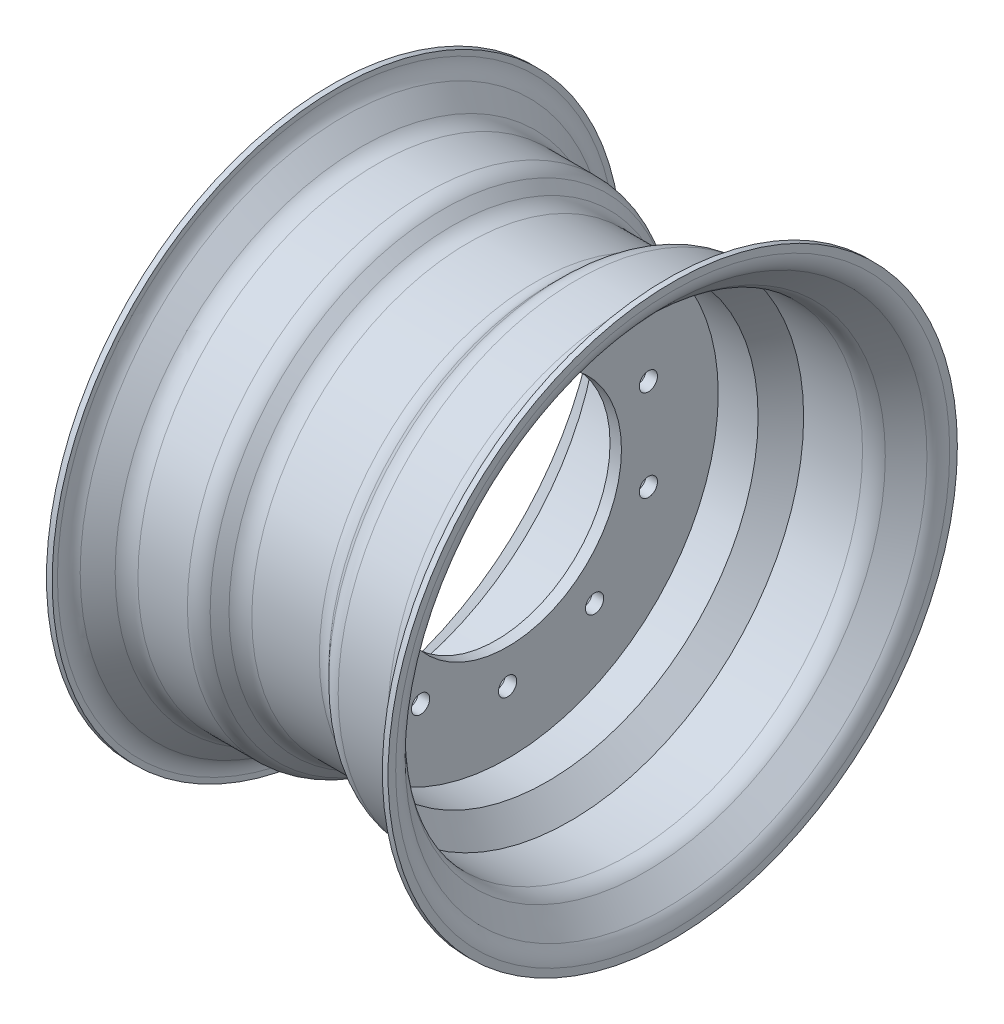
ISO-10303-21;
HEADER;
FILE_DESCRIPTION(('STEP AP214'),'2;1');
FILE_NAME('part.step','',(''),(''),'','','');
FILE_SCHEMA(('AUTOMOTIVE_DESIGN { 1 0 10303 214 1 1 1 1 }'));
ENDSEC;
DATA;
#1=APPLICATION_CONTEXT('core data for automotive mechanical design processes');
#2=APPLICATION_PROTOCOL_DEFINITION('international standard','automotive_design',2000,#1);
#3=PRODUCT_CONTEXT('',#1,'mechanical');
#4=PRODUCT('Part','Part','',(#3));
#5=PRODUCT_RELATED_PRODUCT_CATEGORY('part','',(#4));
#6=PRODUCT_DEFINITION_FORMATION('','',#4);
#7=PRODUCT_DEFINITION_CONTEXT('part definition',#1,'design');
#8=PRODUCT_DEFINITION('design','',#6,#7);
#9=PRODUCT_DEFINITION_SHAPE('','',#8);
#10=(LENGTH_UNIT() NAMED_UNIT(*) SI_UNIT(.MILLI.,.METRE.));
#11=(NAMED_UNIT(*) PLANE_ANGLE_UNIT() SI_UNIT($,.RADIAN.));
#12=(NAMED_UNIT(*) SI_UNIT($,.STERADIAN.) SOLID_ANGLE_UNIT());
#13=UNCERTAINTY_MEASURE_WITH_UNIT(LENGTH_MEASURE(1.E-05),#10,'distance_accuracy_value','');
#14=(GEOMETRIC_REPRESENTATION_CONTEXT(3) GLOBAL_UNCERTAINTY_ASSIGNED_CONTEXT((#13)) GLOBAL_UNIT_ASSIGNED_CONTEXT((#10,
#11,#12)) REPRESENTATION_CONTEXT('',''));
#15=CARTESIAN_POINT('',(0.,0.,0.));
#16=DIRECTION('',(0.,0.,1.));
#17=DIRECTION('',(1.,0.,0.));
#18=AXIS2_PLACEMENT_3D('',#15,#16,#17);
#19=CARTESIAN_POINT('',(0.,0.,0.));
#20=DIRECTION('',(1.,0.,0.));
#21=DIRECTION('',(0.,0.,-1.));
#22=AXIS2_PLACEMENT_3D('',#19,#20,#21);
#23=CYLINDRICAL_SURFACE('',#22,250.);
#24=CARTESIAN_POINT('',(-150.,0.,0.));
#25=DIRECTION('',(1.,0.,0.));
#26=DIRECTION('',(0.,0.,-1.));
#27=AXIS2_PLACEMENT_3D('',#24,#25,#26);
#28=CIRCLE('',#27,250.);
#29=CARTESIAN_POINT('',(-150.,0.,-250.));
#30=VERTEX_POINT('',#29);
#31=EDGE_CURVE('E135',#30,#30,#28,.T.);
#32=ORIENTED_EDGE('',*,*,#31,.T.);
#33=EDGE_LOOP('',(#32));
#34=FACE_BOUND('',#33,.T.);
#35=CARTESIAN_POINT('',(-145.,0.,0.));
#36=DIRECTION('',(1.,0.,0.));
#37=DIRECTION('',(0.,0.,-1.));
#38=AXIS2_PLACEMENT_3D('',#35,#36,#37);
#39=CIRCLE('',#38,250.);
#40=CARTESIAN_POINT('',(-145.,0.,-250.));
#41=VERTEX_POINT('',#40);
#42=EDGE_CURVE('E93',#41,#41,#39,.T.);
#43=ORIENTED_EDGE('',*,*,#42,.F.);
#44=EDGE_LOOP('',(#43));
#45=FACE_BOUND('',#44,.T.);
#46=ADVANCED_FACE('F31',(#34,#45),#23,.T.);
#47=CARTESIAN_POINT('',(-145.,250.,0.));
#48=DIRECTION('',(1.,0.,0.));
#49=DIRECTION('',(0.,0.,-1.));
#50=AXIS2_PLACEMENT_3D('',#47,#48,#49);
#51=PLANE('',#50);
#52=CARTESIAN_POINT('',(-145.,0.,0.));
#53=DIRECTION('',(1.,0.,0.));
#54=DIRECTION('',(0.,0.,-1.));
#55=AXIS2_PLACEMENT_3D('',#52,#53,#54);
#56=CIRCLE('',#55,245.355339059327);
#57=CARTESIAN_POINT('',(-145.,0.,-245.355339059327));
#58=VERTEX_POINT('',#57);
#59=EDGE_CURVE('E72',#58,#58,#56,.F.);
#60=ORIENTED_EDGE('',*,*,#59,.T.);
#61=EDGE_LOOP('',(#60));
#62=FACE_BOUND('',#61,.T.);
#63=ORIENTED_EDGE('',*,*,#42,.T.);
#64=EDGE_LOOP('',(#63));
#65=FACE_BOUND('',#64,.T.);
#66=ADVANCED_FACE('F269',(#62,#65),#51,.T.);
#67=CARTESIAN_POINT('',(-117.928932188135,0.,0.));
#68=DIRECTION('',(-1.,0.,0.));
#69=DIRECTION('',(0.,0.,1.));
#70=AXIS2_PLACEMENT_3D('',#67,#68,#69);
#71=CONICAL_SURFACE('',#70,210.,0.785398163397448);
#72=CARTESIAN_POINT('',(-139.142135623731,0.,0.));
#73=DIRECTION('',(-1.,0.,0.));
#74=DIRECTION('',(0.,0.,1.));
#75=AXIS2_PLACEMENT_3D('',#72,#73,#74);
#76=CIRCLE('',#75,231.213203435596);
#77=CARTESIAN_POINT('',(-139.142135623731,0.,231.213203435596));
#78=VERTEX_POINT('',#77);
#79=EDGE_CURVE('E75',#78,#78,#76,.F.);
#80=ORIENTED_EDGE('',*,*,#79,.T.);
#81=EDGE_LOOP('',(#80));
#82=FACE_BOUND('',#81,.T.);
#83=CARTESIAN_POINT('',(-123.786796564404,0.,0.));
#84=DIRECTION('',(-1.,0.,0.));
#85=DIRECTION('',(0.,0.,1.));
#86=AXIS2_PLACEMENT_3D('',#83,#84,#85);
#87=CIRCLE('',#86,215.857864376269);
#88=CARTESIAN_POINT('',(-123.786796564404,0.,215.857864376269));
#89=VERTEX_POINT('',#88);
#90=EDGE_CURVE('E78',#89,#89,#87,.T.);
#91=ORIENTED_EDGE('',*,*,#90,.T.);
#92=EDGE_LOOP('',(#91));
#93=FACE_BOUND('',#92,.T.);
#94=ADVANCED_FACE('F274',(#82,#93),#71,.T.);
#95=CARTESIAN_POINT('',(0.,0.,0.));
#96=DIRECTION('',(1.,0.,0.));
#97=DIRECTION('',(0.,0.,-1.));
#98=AXIS2_PLACEMENT_3D('',#95,#96,#97);
#99=CYLINDRICAL_SURFACE('',#98,210.);
#100=CARTESIAN_POINT('',(-66.2132034355965,0.,0.));
#101=DIRECTION('',(-1.,0.,0.));
#102=DIRECTION('',(0.,0.,1.));
#103=AXIS2_PLACEMENT_3D('',#100,#101,#102);
#104=CIRCLE('',#103,210.);
#105=CARTESIAN_POINT('',(-66.2132034355965,0.,210.));
#106=VERTEX_POINT('',#105);
#107=EDGE_CURVE('E10',#106,#106,#104,.T.);
#108=ORIENTED_EDGE('',*,*,#107,.T.);
#109=EDGE_LOOP('',(#108));
#110=FACE_BOUND('',#109,.T.);
#111=CARTESIAN_POINT('',(-109.644660940673,0.,0.));
#112=DIRECTION('',(1.,0.,0.));
#113=DIRECTION('',(0.,0.,-1.));
#114=AXIS2_PLACEMENT_3D('',#111,#112,#113);
#115=CIRCLE('',#114,210.);
#116=CARTESIAN_POINT('',(-109.644660940673,0.,-210.));
#117=VERTEX_POINT('',#116);
#118=EDGE_CURVE('E38',#117,#117,#115,.T.);
#119=ORIENTED_EDGE('',*,*,#118,.T.);
#120=EDGE_LOOP('',(#119));
#121=FACE_BOUND('',#120,.T.);
#122=ADVANCED_FACE('F280',(#110,#121),#99,.T.);
#123=CARTESIAN_POINT('',(-37.9289321881346,0.,0.));
#124=DIRECTION('',(-1.,0.,0.));
#125=DIRECTION('',(0.,0.,1.));
#126=AXIS2_PLACEMENT_3D('',#123,#124,#125);
#127=CONICAL_SURFACE('',#126,190.,0.785398163397448);
#128=CARTESIAN_POINT('',(-43.7867965644037,0.,0.));
#129=DIRECTION('',(-1.,0.,0.));
#130=DIRECTION('',(0.,0.,1.));
#131=AXIS2_PLACEMENT_3D('',#128,#129,#130);
#132=CIRCLE('',#131,195.857864376269);
#133=CARTESIAN_POINT('',(-43.7867965644037,0.,195.857864376269));
#134=VERTEX_POINT('',#133);
#135=EDGE_CURVE('E42',#134,#134,#132,.T.);
#136=ORIENTED_EDGE('',*,*,#135,.T.);
#137=EDGE_LOOP('',(#136));
#138=FACE_BOUND('',#137,.T.);
#139=CARTESIAN_POINT('',(-52.0710678118656,0.,0.));
#140=DIRECTION('',(1.,0.,0.));
#141=DIRECTION('',(0.,0.,-1.));
#142=AXIS2_PLACEMENT_3D('',#139,#140,#141);
#143=CIRCLE('',#142,204.142135623731);
#144=CARTESIAN_POINT('',(-52.0710678118656,0.,-204.142135623731));
#145=VERTEX_POINT('',#144);
#146=EDGE_CURVE('E46',#145,#145,#143,.T.);
#147=ORIENTED_EDGE('',*,*,#146,.T.);
#148=EDGE_LOOP('',(#147));
#149=FACE_BOUND('',#148,.T.);
#150=ADVANCED_FACE('F322',(#138,#149),#127,.T.);
#151=CARTESIAN_POINT('',(0.,0.,0.));
#152=DIRECTION('',(1.,0.,0.));
#153=DIRECTION('',(0.,0.,-1.));
#154=AXIS2_PLACEMENT_3D('',#151,#152,#153);
#155=CYLINDRICAL_SURFACE('',#154,190.);
#156=CARTESIAN_POINT('',(29.6446609406728,0.,0.));
#157=DIRECTION('',(1.,0.,0.));
#158=DIRECTION('',(0.,0.,-1.));
#159=AXIS2_PLACEMENT_3D('',#156,#157,#158);
#160=CIRCLE('',#159,190.);
#161=CARTESIAN_POINT('',(29.6446609406728,0.,-190.));
#162=VERTEX_POINT('',#161);
#163=EDGE_CURVE('E51',#162,#162,#160,.F.);
#164=ORIENTED_EDGE('',*,*,#163,.T.);
#165=EDGE_LOOP('',(#164));
#166=FACE_BOUND('',#165,.T.);
#167=CARTESIAN_POINT('',(-29.6446609406727,0.,0.));
#168=DIRECTION('',(1.,0.,0.));
#169=DIRECTION('',(0.,0.,-1.));
#170=AXIS2_PLACEMENT_3D('',#167,#168,#169);
#171=CIRCLE('',#170,190.);
#172=CARTESIAN_POINT('',(-29.6446609406727,0.,-190.));
#173=VERTEX_POINT('',#172);
#174=EDGE_CURVE('E54',#173,#173,#171,.T.);
#175=ORIENTED_EDGE('',*,*,#174,.T.);
#176=EDGE_LOOP('',(#175));
#177=FACE_BOUND('',#176,.T.);
#178=ADVANCED_FACE('F324',(#166,#177),#155,.T.);
#179=CARTESIAN_POINT('',(57.9289321881346,0.,0.));
#180=DIRECTION('',(1.,0.,0.));
#181=DIRECTION('',(0.,0.,-1.));
#182=AXIS2_PLACEMENT_3D('',#179,#180,#181);
#183=CONICAL_SURFACE('',#182,210.,0.785398163397448);
#184=CARTESIAN_POINT('',(52.0710678118655,0.,0.));
#185=DIRECTION('',(-1.,0.,0.));
#186=DIRECTION('',(0.,0.,1.));
#187=AXIS2_PLACEMENT_3D('',#184,#185,#186);
#188=CIRCLE('',#187,204.142135623731);
#189=CARTESIAN_POINT('',(52.0710678118655,0.,204.142135623731));
#190=VERTEX_POINT('',#189);
#191=EDGE_CURVE('E57',#190,#190,#188,.T.);
#192=ORIENTED_EDGE('',*,*,#191,.T.);
#193=EDGE_LOOP('',(#192));
#194=FACE_BOUND('',#193,.T.);
#195=CARTESIAN_POINT('',(43.7867965644037,0.,0.));
#196=DIRECTION('',(1.,0.,0.));
#197=DIRECTION('',(0.,0.,-1.));
#198=AXIS2_PLACEMENT_3D('',#195,#196,#197);
#199=CIRCLE('',#198,195.857864376269);
#200=CARTESIAN_POINT('',(43.7867965644037,0.,-195.857864376269));
#201=VERTEX_POINT('',#200);
#202=EDGE_CURVE('E60',#201,#201,#199,.T.);
#203=ORIENTED_EDGE('',*,*,#202,.T.);
#204=EDGE_LOOP('',(#203));
#205=FACE_BOUND('',#204,.T.);
#206=ADVANCED_FACE('F331',(#194,#205),#183,.T.);
#207=CARTESIAN_POINT('',(0.,0.,0.));
#208=DIRECTION('',(1.,0.,0.));
#209=DIRECTION('',(0.,0.,-1.));
#210=AXIS2_PLACEMENT_3D('',#207,#208,#209);
#211=CYLINDRICAL_SURFACE('',#210,210.);
#212=CARTESIAN_POINT('',(109.644660940673,0.,0.));
#213=DIRECTION('',(1.,0.,0.));
#214=DIRECTION('',(0.,0.,-1.));
#215=AXIS2_PLACEMENT_3D('',#212,#213,#214);
#216=CIRCLE('',#215,210.);
#217=CARTESIAN_POINT('',(109.644660940673,0.,-210.));
#218=VERTEX_POINT('',#217);
#219=EDGE_CURVE('E63',#218,#218,#216,.F.);
#220=ORIENTED_EDGE('',*,*,#219,.T.);
#221=EDGE_LOOP('',(#220));
#222=FACE_BOUND('',#221,.T.);
#223=CARTESIAN_POINT('',(66.2132034355965,0.,0.));
#224=DIRECTION('',(-1.,0.,0.));
#225=DIRECTION('',(0.,0.,1.));
#226=AXIS2_PLACEMENT_3D('',#223,#224,#225);
#227=CIRCLE('',#226,210.);
#228=CARTESIAN_POINT('',(66.2132034355965,0.,210.));
#229=VERTEX_POINT('',#228);
#230=EDGE_CURVE('E66',#229,#229,#227,.F.);
#231=ORIENTED_EDGE('',*,*,#230,.T.);
#232=EDGE_LOOP('',(#231));
#233=FACE_BOUND('',#232,.T.);
#234=ADVANCED_FACE('F337',(#222,#233),#211,.T.);
#235=CARTESIAN_POINT('',(145.,0.,0.));
#236=DIRECTION('',(1.,0.,0.));
#237=DIRECTION('',(0.,0.,-1.));
#238=AXIS2_PLACEMENT_3D('',#235,#236,#237);
#239=CONICAL_SURFACE('',#238,237.071067811865,0.785398163397448);
#240=CARTESIAN_POINT('',(123.786796564404,0.,0.));
#241=DIRECTION('',(1.,0.,0.));
#242=DIRECTION('',(0.,0.,-1.));
#243=AXIS2_PLACEMENT_3D('',#240,#241,#242);
#244=CIRCLE('',#243,215.857864376269);
#245=CARTESIAN_POINT('',(123.786796564404,0.,-215.857864376269));
#246=VERTEX_POINT('',#245);
#247=EDGE_CURVE('E69',#246,#246,#244,.T.);
#248=ORIENTED_EDGE('',*,*,#247,.T.);
#249=EDGE_LOOP('',(#248));
#250=FACE_BOUND('',#249,.T.);
#251=CARTESIAN_POINT('',(145.,0.,0.));
#252=DIRECTION('',(1.,0.,0.));
#253=DIRECTION('',(0.,0.,-1.));
#254=AXIS2_PLACEMENT_3D('',#251,#252,#253);
#255=CIRCLE('',#254,237.071067811865);
#256=CARTESIAN_POINT('',(145.,0.,-237.071067811865));
#257=VERTEX_POINT('',#256);
#258=EDGE_CURVE('E96',#257,#257,#255,.T.);
#259=ORIENTED_EDGE('',*,*,#258,.F.);
#260=EDGE_LOOP('',(#259));
#261=FACE_BOUND('',#260,.T.);
#262=ADVANCED_FACE('F341',(#250,#261),#239,.T.);
#263=CARTESIAN_POINT('',(145.,250.,0.));
#264=DIRECTION('',(-1.,0.,0.));
#265=DIRECTION('',(0.,0.,1.));
#266=AXIS2_PLACEMENT_3D('',#263,#264,#265);
#267=PLANE('',#266);
#268=ORIENTED_EDGE('',*,*,#258,.T.);
#269=EDGE_LOOP('',(#268));
#270=FACE_BOUND('',#269,.T.);
#271=CARTESIAN_POINT('',(145.,0.,0.));
#272=DIRECTION('',(1.,0.,0.));
#273=DIRECTION('',(0.,0.,-1.));
#274=AXIS2_PLACEMENT_3D('',#271,#272,#273);
#275=CIRCLE('',#274,250.);
#276=CARTESIAN_POINT('',(145.,0.,-250.));
#277=VERTEX_POINT('',#276);
#278=EDGE_CURVE('E99',#277,#277,#275,.T.);
#279=ORIENTED_EDGE('',*,*,#278,.F.);
#280=EDGE_LOOP('',(#279));
#281=FACE_BOUND('',#280,.T.);
#282=ADVANCED_FACE('F345',(#270,#281),#267,.T.);
#283=CARTESIAN_POINT('',(0.,0.,0.));
#284=DIRECTION('',(1.,0.,0.));
#285=DIRECTION('',(0.,0.,-1.));
#286=AXIS2_PLACEMENT_3D('',#283,#284,#285);
#287=CYLINDRICAL_SURFACE('',#286,250.);
#288=ORIENTED_EDGE('',*,*,#278,.T.);
#289=EDGE_LOOP('',(#288));
#290=FACE_BOUND('',#289,.T.);
#291=CARTESIAN_POINT('',(150.,0.,0.));
#292=DIRECTION('',(1.,0.,0.));
#293=DIRECTION('',(0.,0.,-1.));
#294=AXIS2_PLACEMENT_3D('',#291,#292,#293);
#295=CIRCLE('',#294,250.);
#296=CARTESIAN_POINT('',(150.,0.,-250.));
#297=VERTEX_POINT('',#296);
#298=EDGE_CURVE('E102',#297,#297,#295,.T.);
#299=ORIENTED_EDGE('',*,*,#298,.F.);
#300=EDGE_LOOP('',(#299));
#301=FACE_BOUND('',#300,.T.);
#302=ADVANCED_FACE('F349',(#290,#301),#287,.T.);
#303=CARTESIAN_POINT('',(150.,250.,0.));
#304=DIRECTION('',(1.,0.,0.));
#305=DIRECTION('',(0.,0.,-1.));
#306=AXIS2_PLACEMENT_3D('',#303,#304,#305);
#307=PLANE('',#306);
#308=CARTESIAN_POINT('',(150.,0.,0.));
#309=DIRECTION('',(1.,0.,0.));
#310=DIRECTION('',(0.,0.,-1.));
#311=AXIS2_PLACEMENT_3D('',#308,#309,#310);
#312=CIRCLE('',#311,243.284271247462);
#313=CARTESIAN_POINT('',(150.,0.,-243.284271247462));
#314=VERTEX_POINT('',#313);
#315=EDGE_CURVE('E81',#314,#314,#312,.F.);
#316=ORIENTED_EDGE('',*,*,#315,.T.);
#317=EDGE_LOOP('',(#316));
#318=FACE_BOUND('',#317,.T.);
#319=ORIENTED_EDGE('',*,*,#298,.T.);
#320=EDGE_LOOP('',(#319));
#321=FACE_BOUND('',#320,.T.);
#322=ADVANCED_FACE('F353',(#318,#321),#307,.T.);
#323=CARTESIAN_POINT('',(120.,0.,0.));
#324=DIRECTION('',(1.,0.,0.));
#325=DIRECTION('',(0.,0.,-1.));
#326=AXIS2_PLACEMENT_3D('',#323,#324,#325);
#327=CONICAL_SURFACE('',#326,205.,0.785398163397447);
#328=CARTESIAN_POINT('',(125.857864376269,0.,0.));
#329=DIRECTION('',(-1.,0.,0.));
#330=DIRECTION('',(0.,0.,1.));
#331=AXIS2_PLACEMENT_3D('',#328,#329,#330);
#332=CIRCLE('',#331,210.857864376269);
#333=CARTESIAN_POINT('',(125.857864376269,0.,210.857864376269));
#334=VERTEX_POINT('',#333);
#335=EDGE_CURVE('E84',#334,#334,#332,.T.);
#336=ORIENTED_EDGE('',*,*,#335,.T.);
#337=EDGE_LOOP('',(#336));
#338=FACE_BOUND('',#337,.T.);
#339=CARTESIAN_POINT('',(144.142135623731,0.,0.));
#340=DIRECTION('',(-1.,0.,0.));
#341=DIRECTION('',(0.,0.,1.));
#342=AXIS2_PLACEMENT_3D('',#339,#340,#341);
#343=CIRCLE('',#342,229.142135623731);
#344=CARTESIAN_POINT('',(144.142135623731,0.,229.142135623731));
#345=VERTEX_POINT('',#344);
#346=EDGE_CURVE('E87',#345,#345,#343,.F.);
#347=ORIENTED_EDGE('',*,*,#346,.T.);
#348=EDGE_LOOP('',(#347));
#349=FACE_BOUND('',#348,.T.);
#350=ADVANCED_FACE('F357',(#338,#349),#327,.F.);
#351=CARTESIAN_POINT('',(0.,0.,0.));
#352=DIRECTION('',(1.,0.,0.));
#353=DIRECTION('',(0.,0.,-1.));
#354=AXIS2_PLACEMENT_3D('',#351,#352,#353);
#355=CYLINDRICAL_SURFACE('',#354,205.);
#356=CARTESIAN_POINT('',(111.715728752538,0.,0.));
#357=DIRECTION('',(-1.,0.,0.));
#358=DIRECTION('',(0.,0.,1.));
#359=AXIS2_PLACEMENT_3D('',#356,#357,#358);
#360=CIRCLE('',#359,205.);
#361=CARTESIAN_POINT('',(111.715728752538,0.,205.));
#362=VERTEX_POINT('',#361);
#363=EDGE_CURVE('E90',#362,#362,#360,.F.);
#364=ORIENTED_EDGE('',*,*,#363,.T.);
#365=EDGE_LOOP('',(#364));
#366=FACE_BOUND('',#365,.T.);
#367=CARTESIAN_POINT('',(60.,0.,0.));
#368=DIRECTION('',(1.,0.,0.));
#369=DIRECTION('',(0.,0.,-1.));
#370=AXIS2_PLACEMENT_3D('',#367,#368,#369);
#371=CIRCLE('',#370,205.);
#372=CARTESIAN_POINT('',(60.,0.,-205.));
#373=VERTEX_POINT('',#372);
#374=EDGE_CURVE('E105',#373,#373,#371,.T.);
#375=ORIENTED_EDGE('',*,*,#374,.F.);
#376=EDGE_LOOP('',(#375));
#377=FACE_BOUND('',#376,.T.);
#378=ADVANCED_FACE('F361',(#366,#377),#355,.F.);
#379=CARTESIAN_POINT('',(40.,0.,0.));
#380=DIRECTION('',(1.,0.,0.));
#381=DIRECTION('',(0.,0.,-1.));
#382=AXIS2_PLACEMENT_3D('',#379,#380,#381);
#383=CONICAL_SURFACE('',#382,185.,0.785398163397446);
#384=ORIENTED_EDGE('',*,*,#374,.T.);
#385=EDGE_LOOP('',(#384));
#386=FACE_BOUND('',#385,.T.);
#387=CARTESIAN_POINT('',(40.,0.,0.));
#388=DIRECTION('',(1.,0.,0.));
#389=DIRECTION('',(0.,0.,-1.));
#390=AXIS2_PLACEMENT_3D('',#387,#388,#389);
#391=CIRCLE('',#390,185.);
#392=CARTESIAN_POINT('',(40.,0.,-185.));
#393=VERTEX_POINT('',#392);
#394=EDGE_CURVE('E108',#393,#393,#391,.T.);
#395=ORIENTED_EDGE('',*,*,#394,.F.);
#396=EDGE_LOOP('',(#395));
#397=FACE_BOUND('',#396,.T.);
#398=ADVANCED_FACE('F365',(#386,#397),#383,.F.);
#399=CARTESIAN_POINT('',(0.,0.,0.));
#400=DIRECTION('',(1.,0.,0.));
#401=DIRECTION('',(0.,0.,-1.));
#402=AXIS2_PLACEMENT_3D('',#399,#400,#401);
#403=CYLINDRICAL_SURFACE('',#402,185.);
#404=ORIENTED_EDGE('',*,*,#394,.T.);
#405=EDGE_LOOP('',(#404));
#406=FACE_BOUND('',#405,.T.);
#407=CARTESIAN_POINT('',(4.99999999999993,0.,0.));
#408=DIRECTION('',(1.,0.,0.));
#409=DIRECTION('',(0.,0.,-1.));
#410=AXIS2_PLACEMENT_3D('',#407,#408,#409);
#411=CIRCLE('',#410,185.);
#412=CARTESIAN_POINT('',(4.99999999999993,0.,-185.));
#413=VERTEX_POINT('',#412);
#414=EDGE_CURVE('E111',#413,#413,#411,.T.);
#415=ORIENTED_EDGE('',*,*,#414,.F.);
#416=EDGE_LOOP('',(#415));
#417=FACE_BOUND('',#416,.T.);
#418=ADVANCED_FACE('F214',(#406,#417),#403,.F.);
#419=CARTESIAN_POINT('',(4.99999999999995,185.,0.));
#420=DIRECTION('',(1.,0.,0.));
#421=DIRECTION('',(0.,0.,-1.));
#422=AXIS2_PLACEMENT_3D('',#419,#420,#421);
#423=PLANE('',#422);
#424=CARTESIAN_POINT('',(4.99999999999995,105.172209268744,-76.4120827980201));
#425=DIRECTION('',(1.,0.,0.));
#426=DIRECTION('',(0.,-0.587785252292462,-0.809016994374955));
#427=AXIS2_PLACEMENT_3D('',#424,#425,#426);
#428=CIRCLE('',#427,8.);
#429=CARTESIAN_POINT('',(4.99999999999995,100.469927250404,-82.8842187530198));
#430=VERTEX_POINT('',#429);
#431=EDGE_CURVE('E151',#430,#430,#428,.T.);
#432=ORIENTED_EDGE('',*,*,#431,.F.);
#433=EDGE_LOOP('',(#432));
#434=FACE_BOUND('',#433,.T.);
#435=CARTESIAN_POINT('',(4.99999999999995,40.1722092687446,-123.63734711837));
#436=DIRECTION('',(1.,0.,0.));
#437=DIRECTION('',(0.,-0.95105651629515,-0.309016994374958));
#438=AXIS2_PLACEMENT_3D('',#435,#436,#437);
#439=CIRCLE('',#438,8.);
#440=CARTESIAN_POINT('',(4.99999999999995,32.5637571383834,-126.109483073369));
#441=VERTEX_POINT('',#440);
#442=EDGE_CURVE('E157',#441,#441,#439,.T.);
#443=ORIENTED_EDGE('',*,*,#442,.F.);
#444=EDGE_LOOP('',(#443));
#445=FACE_BOUND('',#444,.T.);
#446=CARTESIAN_POINT('',(4.99999999999995,-40.172209268742,-123.63734711837));
#447=DIRECTION('',(1.,0.,0.));
#448=DIRECTION('',(0.,-0.951056516295157,0.309016994374938));
#449=AXIS2_PLACEMENT_3D('',#446,#447,#448);
#450=CIRCLE('',#449,8.);
#451=CARTESIAN_POINT('',(4.99999999999995,-47.7806613991032,-121.165211163371));
#452=VERTEX_POINT('',#451);
#453=EDGE_CURVE('E163',#452,#452,#450,.T.);
#454=ORIENTED_EDGE('',*,*,#453,.F.);
#455=EDGE_LOOP('',(#454));
#456=FACE_BOUND('',#455,.T.);
#457=CARTESIAN_POINT('',(4.99999999999995,-105.172209268742,-76.4120827980224));
#458=DIRECTION('',(1.,0.,0.));
#459=DIRECTION('',(0.,-0.58778525229248,0.809016994374942));
#460=AXIS2_PLACEMENT_3D('',#457,#458,#459);
#461=CIRCLE('',#460,8.);
#462=CARTESIAN_POINT('',(4.99999999999995,-109.874491287082,-69.9399468430229));
#463=VERTEX_POINT('',#462);
#464=EDGE_CURVE('E169',#463,#463,#461,.T.);
#465=ORIENTED_EDGE('',*,*,#464,.F.);
#466=EDGE_LOOP('',(#465));
#467=FACE_BOUND('',#466,.T.);
#468=CARTESIAN_POINT('',(4.99999999999995,-130.,0.));
#469=DIRECTION('',(1.,0.,0.));
#470=DIRECTION('',(0.,0.,1.));
#471=AXIS2_PLACEMENT_3D('',#468,#469,#470);
#472=CIRCLE('',#471,8.);
#473=CARTESIAN_POINT('',(4.99999999999995,-130.,8.));
#474=VERTEX_POINT('',#473);
#475=EDGE_CURVE('E175',#474,#474,#472,.T.);
#476=ORIENTED_EDGE('',*,*,#475,.F.);
#477=EDGE_LOOP('',(#476));
#478=FACE_BOUND('',#477,.T.);
#479=CARTESIAN_POINT('',(4.99999999999995,-105.172209268744,76.4120827980209));
#480=DIRECTION('',(1.,0.,0.));
#481=DIRECTION('',(0.,0.587785252292469,0.809016994374951));
#482=AXIS2_PLACEMENT_3D('',#479,#480,#481);
#483=CIRCLE('',#482,8.);
#484=CARTESIAN_POINT('',(4.99999999999995,-100.469927250404,82.8842187530205));
#485=VERTEX_POINT('',#484);
#486=EDGE_CURVE('E181',#485,#485,#483,.T.);
#487=ORIENTED_EDGE('',*,*,#486,.F.);
#488=EDGE_LOOP('',(#487));
#489=FACE_BOUND('',#488,.T.);
#490=CARTESIAN_POINT('',(4.99999999999995,-40.1722092687437,123.63734711837));
#491=DIRECTION('',(1.,0.,0.));
#492=DIRECTION('',(0.,0.951056516295152,0.309016994374952));
#493=AXIS2_PLACEMENT_3D('',#490,#491,#492);
#494=CIRCLE('',#493,8.);
#495=CARTESIAN_POINT('',(4.99999999999995,-32.5637571383825,126.109483073369));
#496=VERTEX_POINT('',#495);
#497=EDGE_CURVE('E187',#496,#496,#494,.T.);
#498=ORIENTED_EDGE('',*,*,#497,.F.);
#499=EDGE_LOOP('',(#498));
#500=FACE_BOUND('',#499,.T.);
#501=CARTESIAN_POINT('',(4.99999999999995,40.1722092687428,123.63734711837));
#502=DIRECTION('',(1.,0.,0.));
#503=DIRECTION('',(0.,0.951056516295155,-0.309016994374945));
#504=AXIS2_PLACEMENT_3D('',#501,#502,#503);
#505=CIRCLE('',#504,8.);
#506=CARTESIAN_POINT('',(4.99999999999995,47.7806613991041,121.165211163371));
#507=VERTEX_POINT('',#506);
#508=EDGE_CURVE('E193',#507,#507,#505,.T.);
#509=ORIENTED_EDGE('',*,*,#508,.F.);
#510=EDGE_LOOP('',(#509));
#511=FACE_BOUND('',#510,.T.);
#512=CARTESIAN_POINT('',(4.99999999999995,105.172209268743,76.4120827980217));
#513=DIRECTION('',(1.,0.,0.));
#514=DIRECTION('',(0.,0.587785252292474,-0.809016994374947));
#515=AXIS2_PLACEMENT_3D('',#512,#513,#514);
#516=CIRCLE('',#515,8.);
#517=CARTESIAN_POINT('',(4.99999999999995,109.874491287083,69.9399468430221));
#518=VERTEX_POINT('',#517);
#519=EDGE_CURVE('E145',#518,#518,#516,.T.);
#520=ORIENTED_EDGE('',*,*,#519,.F.);
#521=EDGE_LOOP('',(#520));
#522=FACE_BOUND('',#521,.T.);
#523=CARTESIAN_POINT('',(4.99999999999995,130.,0.));
#524=DIRECTION('',(1.,0.,0.));
#525=DIRECTION('',(0.,0.,-1.));
#526=AXIS2_PLACEMENT_3D('',#523,#524,#525);
#527=CIRCLE('',#526,8.);
#528=CARTESIAN_POINT('',(4.99999999999995,130.,-8.));
#529=VERTEX_POINT('',#528);
#530=EDGE_CURVE('E139',#529,#529,#527,.T.);
#531=ORIENTED_EDGE('',*,*,#530,.F.);
#532=EDGE_LOOP('',(#531));
#533=FACE_BOUND('',#532,.T.);
#534=ORIENTED_EDGE('',*,*,#414,.T.);
#535=EDGE_LOOP('',(#534));
#536=FACE_BOUND('',#535,.T.);
#537=CARTESIAN_POINT('',(4.99999999999996,0.,0.));
#538=DIRECTION('',(1.,0.,0.));
#539=DIRECTION('',(0.,0.,-1.));
#540=AXIS2_PLACEMENT_3D('',#537,#538,#539);
#541=CIRCLE('',#540,100.);
#542=CARTESIAN_POINT('',(4.99999999999996,0.,-100.));
#543=VERTEX_POINT('',#542);
#544=EDGE_CURVE('E114',#543,#543,#541,.T.);
#545=ORIENTED_EDGE('',*,*,#544,.F.);
#546=EDGE_LOOP('',(#545));
#547=FACE_BOUND('',#546,.T.);
#548=ADVANCED_FACE('F210',(#434,#445,#456,#467,#478,#489,#500,#511,#522,#533,#536,#547),#423,.T.);
#549=CARTESIAN_POINT('',(0.,0.,0.));
#550=DIRECTION('',(1.,0.,0.));
#551=DIRECTION('',(0.,0.,-1.));
#552=AXIS2_PLACEMENT_3D('',#549,#550,#551);
#553=CYLINDRICAL_SURFACE('',#552,100.);
#554=ORIENTED_EDGE('',*,*,#544,.T.);
#555=EDGE_LOOP('',(#554));
#556=FACE_BOUND('',#555,.T.);
#557=CARTESIAN_POINT('',(-5.00000000000004,0.,0.));
#558=DIRECTION('',(1.,0.,0.));
#559=DIRECTION('',(0.,0.,-1.));
#560=AXIS2_PLACEMENT_3D('',#557,#558,#559);
#561=CIRCLE('',#560,100.);
#562=CARTESIAN_POINT('',(-5.00000000000004,0.,-100.));
#563=VERTEX_POINT('',#562);
#564=EDGE_CURVE('E117',#563,#563,#561,.T.);
#565=ORIENTED_EDGE('',*,*,#564,.F.);
#566=EDGE_LOOP('',(#565));
#567=FACE_BOUND('',#566,.T.);
#568=ADVANCED_FACE('F213',(#556,#567),#553,.F.);
#569=CARTESIAN_POINT('',(-5.00000000000006,185.,0.));
#570=DIRECTION('',(-1.,0.,0.));
#571=DIRECTION('',(0.,0.,1.));
#572=AXIS2_PLACEMENT_3D('',#569,#570,#571);
#573=PLANE('',#572);
#574=CARTESIAN_POINT('',(-5.00000000000006,105.172209268744,-76.4120827980201));
#575=DIRECTION('',(1.,0.,0.));
#576=DIRECTION('',(0.,-0.587785252292462,-0.809016994374955));
#577=AXIS2_PLACEMENT_3D('',#574,#575,#576);
#578=CIRCLE('',#577,8.);
#579=CARTESIAN_POINT('',(-5.00000000000006,100.469927250404,-82.8842187530198));
#580=VERTEX_POINT('',#579);
#581=EDGE_CURVE('E154',#580,#580,#578,.T.);
#582=ORIENTED_EDGE('',*,*,#581,.T.);
#583=EDGE_LOOP('',(#582));
#584=FACE_BOUND('',#583,.T.);
#585=CARTESIAN_POINT('',(-5.00000000000006,40.1722092687446,-123.63734711837));
#586=DIRECTION('',(1.,0.,0.));
#587=DIRECTION('',(0.,-0.95105651629515,-0.309016994374958));
#588=AXIS2_PLACEMENT_3D('',#585,#586,#587);
#589=CIRCLE('',#588,8.);
#590=CARTESIAN_POINT('',(-5.00000000000006,32.5637571383834,-126.109483073369));
#591=VERTEX_POINT('',#590);
#592=EDGE_CURVE('E160',#591,#591,#589,.T.);
#593=ORIENTED_EDGE('',*,*,#592,.T.);
#594=EDGE_LOOP('',(#593));
#595=FACE_BOUND('',#594,.T.);
#596=CARTESIAN_POINT('',(-5.00000000000006,-40.172209268742,-123.63734711837));
#597=DIRECTION('',(1.,0.,0.));
#598=DIRECTION('',(0.,-0.951056516295157,0.309016994374938));
#599=AXIS2_PLACEMENT_3D('',#596,#597,#598);
#600=CIRCLE('',#599,8.);
#601=CARTESIAN_POINT('',(-5.00000000000006,-47.7806613991032,-121.165211163371));
#602=VERTEX_POINT('',#601);
#603=EDGE_CURVE('E166',#602,#602,#600,.T.);
#604=ORIENTED_EDGE('',*,*,#603,.T.);
#605=EDGE_LOOP('',(#604));
#606=FACE_BOUND('',#605,.T.);
#607=CARTESIAN_POINT('',(-5.00000000000006,-105.172209268742,-76.4120827980224));
#608=DIRECTION('',(1.,0.,0.));
#609=DIRECTION('',(0.,-0.58778525229248,0.809016994374942));
#610=AXIS2_PLACEMENT_3D('',#607,#608,#609);
#611=CIRCLE('',#610,8.);
#612=CARTESIAN_POINT('',(-5.00000000000006,-109.874491287082,-69.9399468430229));
#613=VERTEX_POINT('',#612);
#614=EDGE_CURVE('E172',#613,#613,#611,.T.);
#615=ORIENTED_EDGE('',*,*,#614,.T.);
#616=EDGE_LOOP('',(#615));
#617=FACE_BOUND('',#616,.T.);
#618=CARTESIAN_POINT('',(-5.00000000000006,-130.,0.));
#619=DIRECTION('',(1.,0.,0.));
#620=DIRECTION('',(0.,0.,1.));
#621=AXIS2_PLACEMENT_3D('',#618,#619,#620);
#622=CIRCLE('',#621,8.);
#623=CARTESIAN_POINT('',(-5.00000000000006,-130.,8.));
#624=VERTEX_POINT('',#623);
#625=EDGE_CURVE('E178',#624,#624,#622,.T.);
#626=ORIENTED_EDGE('',*,*,#625,.T.);
#627=EDGE_LOOP('',(#626));
#628=FACE_BOUND('',#627,.T.);
#629=CARTESIAN_POINT('',(-5.00000000000006,-105.172209268744,76.4120827980209));
#630=DIRECTION('',(1.,0.,0.));
#631=DIRECTION('',(0.,0.587785252292469,0.809016994374951));
#632=AXIS2_PLACEMENT_3D('',#629,#630,#631);
#633=CIRCLE('',#632,8.);
#634=CARTESIAN_POINT('',(-5.00000000000006,-100.469927250404,82.8842187530205));
#635=VERTEX_POINT('',#634);
#636=EDGE_CURVE('E184',#635,#635,#633,.T.);
#637=ORIENTED_EDGE('',*,*,#636,.T.);
#638=EDGE_LOOP('',(#637));
#639=FACE_BOUND('',#638,.T.);
#640=CARTESIAN_POINT('',(-5.00000000000006,-40.1722092687437,123.63734711837));
#641=DIRECTION('',(1.,0.,0.));
#642=DIRECTION('',(0.,0.951056516295152,0.309016994374952));
#643=AXIS2_PLACEMENT_3D('',#640,#641,#642);
#644=CIRCLE('',#643,8.);
#645=CARTESIAN_POINT('',(-5.00000000000006,-32.5637571383825,126.109483073369));
#646=VERTEX_POINT('',#645);
#647=EDGE_CURVE('E190',#646,#646,#644,.T.);
#648=ORIENTED_EDGE('',*,*,#647,.T.);
#649=EDGE_LOOP('',(#648));
#650=FACE_BOUND('',#649,.T.);
#651=CARTESIAN_POINT('',(-5.00000000000006,40.1722092687428,123.63734711837));
#652=DIRECTION('',(1.,0.,0.));
#653=DIRECTION('',(0.,0.951056516295155,-0.309016994374945));
#654=AXIS2_PLACEMENT_3D('',#651,#652,#653);
#655=CIRCLE('',#654,8.);
#656=CARTESIAN_POINT('',(-5.00000000000006,47.7806613991041,121.165211163371));
#657=VERTEX_POINT('',#656);
#658=EDGE_CURVE('E148',#657,#657,#655,.T.);
#659=ORIENTED_EDGE('',*,*,#658,.T.);
#660=EDGE_LOOP('',(#659));
#661=FACE_BOUND('',#660,.T.);
#662=CARTESIAN_POINT('',(-5.00000000000006,105.172209268743,76.4120827980217));
#663=DIRECTION('',(1.,0.,0.));
#664=DIRECTION('',(0.,0.587785252292474,-0.809016994374947));
#665=AXIS2_PLACEMENT_3D('',#662,#663,#664);
#666=CIRCLE('',#665,8.);
#667=CARTESIAN_POINT('',(-5.00000000000006,109.874491287083,69.9399468430221));
#668=VERTEX_POINT('',#667);
#669=EDGE_CURVE('E142',#668,#668,#666,.T.);
#670=ORIENTED_EDGE('',*,*,#669,.T.);
#671=EDGE_LOOP('',(#670));
#672=FACE_BOUND('',#671,.T.);
#673=CARTESIAN_POINT('',(-5.00000000000006,130.,0.));
#674=DIRECTION('',(1.,0.,0.));
#675=DIRECTION('',(0.,0.,-1.));
#676=AXIS2_PLACEMENT_3D('',#673,#674,#675);
#677=CIRCLE('',#676,8.);
#678=CARTESIAN_POINT('',(-5.00000000000006,130.,-8.));
#679=VERTEX_POINT('',#678);
#680=EDGE_CURVE('E138',#679,#679,#677,.T.);
#681=ORIENTED_EDGE('',*,*,#680,.T.);
#682=EDGE_LOOP('',(#681));
#683=FACE_BOUND('',#682,.T.);
#684=ORIENTED_EDGE('',*,*,#564,.T.);
#685=EDGE_LOOP('',(#684));
#686=FACE_BOUND('',#685,.T.);
#687=CARTESIAN_POINT('',(-5.00000000000007,0.,0.));
#688=DIRECTION('',(1.,0.,0.));
#689=DIRECTION('',(0.,0.,-1.));
#690=AXIS2_PLACEMENT_3D('',#687,#688,#689);
#691=CIRCLE('',#690,185.);
#692=CARTESIAN_POINT('',(-5.00000000000007,0.,-185.));
#693=VERTEX_POINT('',#692);
#694=EDGE_CURVE('E120',#693,#693,#691,.T.);
#695=ORIENTED_EDGE('',*,*,#694,.F.);
#696=EDGE_LOOP('',(#695));
#697=FACE_BOUND('',#696,.T.);
#698=ADVANCED_FACE('F199',(#584,#595,#606,#617,#628,#639,#650,#661,#672,#683,#686,#697),#573,.T.);
#699=CARTESIAN_POINT('',(0.,0.,0.));
#700=DIRECTION('',(1.,0.,0.));
#701=DIRECTION('',(0.,0.,-1.));
#702=AXIS2_PLACEMENT_3D('',#699,#700,#701);
#703=CYLINDRICAL_SURFACE('',#702,185.);
#704=ORIENTED_EDGE('',*,*,#694,.T.);
#705=EDGE_LOOP('',(#704));
#706=FACE_BOUND('',#705,.T.);
#707=CARTESIAN_POINT('',(-40.,0.,0.));
#708=DIRECTION('',(1.,0.,0.));
#709=DIRECTION('',(0.,0.,-1.));
#710=AXIS2_PLACEMENT_3D('',#707,#708,#709);
#711=CIRCLE('',#710,185.);
#712=CARTESIAN_POINT('',(-40.,0.,-185.));
#713=VERTEX_POINT('',#712);
#714=EDGE_CURVE('E123',#713,#713,#711,.T.);
#715=ORIENTED_EDGE('',*,*,#714,.F.);
#716=EDGE_LOOP('',(#715));
#717=FACE_BOUND('',#716,.T.);
#718=ADVANCED_FACE('F232',(#706,#717),#703,.F.);
#719=CARTESIAN_POINT('',(-60.,0.,0.));
#720=DIRECTION('',(-1.,0.,0.));
#721=DIRECTION('',(0.,0.,1.));
#722=AXIS2_PLACEMENT_3D('',#719,#720,#721);
#723=CONICAL_SURFACE('',#722,205.,0.785398163397447);
#724=ORIENTED_EDGE('',*,*,#714,.T.);
#725=EDGE_LOOP('',(#724));
#726=FACE_BOUND('',#725,.T.);
#727=CARTESIAN_POINT('',(-60.,0.,0.));
#728=DIRECTION('',(1.,0.,0.));
#729=DIRECTION('',(0.,0.,-1.));
#730=AXIS2_PLACEMENT_3D('',#727,#728,#729);
#731=CIRCLE('',#730,205.);
#732=CARTESIAN_POINT('',(-60.,0.,-205.));
#733=VERTEX_POINT('',#732);
#734=EDGE_CURVE('E126',#733,#733,#731,.T.);
#735=ORIENTED_EDGE('',*,*,#734,.F.);
#736=EDGE_LOOP('',(#735));
#737=FACE_BOUND('',#736,.T.);
#738=ADVANCED_FACE('F239',(#726,#737),#723,.F.);
#739=CARTESIAN_POINT('',(0.,0.,0.));
#740=DIRECTION('',(1.,0.,0.));
#741=DIRECTION('',(0.,0.,-1.));
#742=AXIS2_PLACEMENT_3D('',#739,#740,#741);
#743=CYLINDRICAL_SURFACE('',#742,205.);
#744=ORIENTED_EDGE('',*,*,#734,.T.);
#745=EDGE_LOOP('',(#744));
#746=FACE_BOUND('',#745,.T.);
#747=CARTESIAN_POINT('',(-120.,0.,0.));
#748=DIRECTION('',(1.,0.,0.));
#749=DIRECTION('',(0.,0.,-1.));
#750=AXIS2_PLACEMENT_3D('',#747,#748,#749);
#751=CIRCLE('',#750,205.);
#752=CARTESIAN_POINT('',(-120.,0.,-205.));
#753=VERTEX_POINT('',#752);
#754=EDGE_CURVE('E129',#753,#753,#751,.T.);
#755=ORIENTED_EDGE('',*,*,#754,.F.);
#756=EDGE_LOOP('',(#755));
#757=FACE_BOUND('',#756,.T.);
#758=ADVANCED_FACE('F245',(#746,#757),#743,.F.);
#759=CARTESIAN_POINT('',(-150.,0.,0.));
#760=DIRECTION('',(-1.,0.,0.));
#761=DIRECTION('',(0.,0.,1.));
#762=AXIS2_PLACEMENT_3D('',#759,#760,#761);
#763=CONICAL_SURFACE('',#762,235.,0.785398163397447);
#764=ORIENTED_EDGE('',*,*,#754,.T.);
#765=EDGE_LOOP('',(#764));
#766=FACE_BOUND('',#765,.T.);
#767=CARTESIAN_POINT('',(-150.,0.,0.));
#768=DIRECTION('',(1.,0.,0.));
#769=DIRECTION('',(0.,0.,-1.));
#770=AXIS2_PLACEMENT_3D('',#767,#768,#769);
#771=CIRCLE('',#770,235.);
#772=CARTESIAN_POINT('',(-150.,0.,-235.));
#773=VERTEX_POINT('',#772);
#774=EDGE_CURVE('E132',#773,#773,#771,.T.);
#775=ORIENTED_EDGE('',*,*,#774,.F.);
#776=EDGE_LOOP('',(#775));
#777=FACE_BOUND('',#776,.T.);
#778=ADVANCED_FACE('F251',(#766,#777),#763,.F.);
#779=CARTESIAN_POINT('',(-150.,250.,0.));
#780=DIRECTION('',(-1.,0.,0.));
#781=DIRECTION('',(0.,0.,1.));
#782=AXIS2_PLACEMENT_3D('',#779,#780,#781);
#783=PLANE('',#782);
#784=ORIENTED_EDGE('',*,*,#774,.T.);
#785=EDGE_LOOP('',(#784));
#786=FACE_BOUND('',#785,.T.);
#787=ORIENTED_EDGE('',*,*,#31,.F.);
#788=EDGE_LOOP('',(#787));
#789=FACE_BOUND('',#788,.T.);
#790=ADVANCED_FACE('F257',(#786,#789),#783,.T.);
#791=CARTESIAN_POINT('',(111.715728752538,0.,0.));
#792=DIRECTION('',(-1.,0.,0.));
#793=DIRECTION('',(0.,0.,1.));
#794=AXIS2_PLACEMENT_3D('',#791,#792,#793);
#795=TOROIDAL_SURFACE('',#794,225.,20.);
#796=ORIENTED_EDGE('',*,*,#335,.F.);
#797=EDGE_LOOP('',(#796));
#798=FACE_BOUND('',#797,.T.);
#799=ORIENTED_EDGE('',*,*,#363,.F.);
#800=EDGE_LOOP('',(#799));
#801=FACE_BOUND('',#800,.T.);
#802=ADVANCED_FACE('F263',(#798,#801),#795,.T.);
#803=CARTESIAN_POINT('',(130.,0.,0.));
#804=DIRECTION('',(1.,0.,0.));
#805=DIRECTION('',(0.,0.,-1.));
#806=AXIS2_PLACEMENT_3D('',#803,#804,#805);
#807=TOROIDAL_SURFACE('',#806,243.284271247462,20.);
#808=ORIENTED_EDGE('',*,*,#315,.F.);
#809=EDGE_LOOP('',(#808));
#810=FACE_BOUND('',#809,.T.);
#811=ORIENTED_EDGE('',*,*,#346,.F.);
#812=EDGE_LOOP('',(#811));
#813=FACE_BOUND('',#812,.T.);
#814=ADVANCED_FACE('F287',(#810,#813),#807,.T.);
#815=CARTESIAN_POINT('',(-125.,0.,0.));
#816=DIRECTION('',(1.,0.,0.));
#817=DIRECTION('',(0.,0.,-1.));
#818=AXIS2_PLACEMENT_3D('',#815,#816,#817);
#819=TOROIDAL_SURFACE('',#818,245.355339059327,20.);
#820=ORIENTED_EDGE('',*,*,#59,.F.);
#821=EDGE_LOOP('',(#820));
#822=FACE_BOUND('',#821,.T.);
#823=ORIENTED_EDGE('',*,*,#79,.F.);
#824=EDGE_LOOP('',(#823));
#825=FACE_BOUND('',#824,.T.);
#826=ADVANCED_FACE('F291',(#822,#825),#819,.F.);
#827=CARTESIAN_POINT('',(109.644660940673,0.,0.));
#828=DIRECTION('',(1.,0.,0.));
#829=DIRECTION('',(0.,0.,-1.));
#830=AXIS2_PLACEMENT_3D('',#827,#828,#829);
#831=TOROIDAL_SURFACE('',#830,230.,20.);
#832=ORIENTED_EDGE('',*,*,#219,.F.);
#833=EDGE_LOOP('',(#832));
#834=FACE_BOUND('',#833,.T.);
#835=ORIENTED_EDGE('',*,*,#247,.F.);
#836=EDGE_LOOP('',(#835));
#837=FACE_BOUND('',#836,.T.);
#838=ADVANCED_FACE('F295',(#834,#837),#831,.F.);
#839=CARTESIAN_POINT('',(66.2132034355965,0.,0.));
#840=DIRECTION('',(-1.,0.,0.));
#841=DIRECTION('',(0.,0.,1.));
#842=AXIS2_PLACEMENT_3D('',#839,#840,#841);
#843=TOROIDAL_SURFACE('',#842,190.,20.);
#844=ORIENTED_EDGE('',*,*,#191,.F.);
#845=EDGE_LOOP('',(#844));
#846=FACE_BOUND('',#845,.T.);
#847=ORIENTED_EDGE('',*,*,#230,.F.);
#848=EDGE_LOOP('',(#847));
#849=FACE_BOUND('',#848,.T.);
#850=ADVANCED_FACE('F299',(#846,#849),#843,.T.);
#851=CARTESIAN_POINT('',(29.6446609406728,0.,0.));
#852=DIRECTION('',(1.,0.,0.));
#853=DIRECTION('',(0.,0.,-1.));
#854=AXIS2_PLACEMENT_3D('',#851,#852,#853);
#855=TOROIDAL_SURFACE('',#854,210.,20.);
#856=ORIENTED_EDGE('',*,*,#163,.F.);
#857=EDGE_LOOP('',(#856));
#858=FACE_BOUND('',#857,.T.);
#859=ORIENTED_EDGE('',*,*,#202,.F.);
#860=EDGE_LOOP('',(#859));
#861=FACE_BOUND('',#860,.T.);
#862=ADVANCED_FACE('F303',(#858,#861),#855,.F.);
#863=CARTESIAN_POINT('',(-29.6446609406727,0.,0.));
#864=DIRECTION('',(1.,0.,0.));
#865=DIRECTION('',(0.,0.,-1.));
#866=AXIS2_PLACEMENT_3D('',#863,#864,#865);
#867=TOROIDAL_SURFACE('',#866,210.,20.);
#868=ORIENTED_EDGE('',*,*,#135,.F.);
#869=EDGE_LOOP('',(#868));
#870=FACE_BOUND('',#869,.T.);
#871=ORIENTED_EDGE('',*,*,#174,.F.);
#872=EDGE_LOOP('',(#871));
#873=FACE_BOUND('',#872,.T.);
#874=ADVANCED_FACE('F307',(#870,#873),#867,.F.);
#875=CARTESIAN_POINT('',(-66.2132034355965,0.,0.));
#876=DIRECTION('',(-1.,0.,0.));
#877=DIRECTION('',(0.,0.,1.));
#878=AXIS2_PLACEMENT_3D('',#875,#876,#877);
#879=TOROIDAL_SURFACE('',#878,190.,20.);
#880=ORIENTED_EDGE('',*,*,#107,.F.);
#881=EDGE_LOOP('',(#880));
#882=FACE_BOUND('',#881,.T.);
#883=ORIENTED_EDGE('',*,*,#146,.F.);
#884=EDGE_LOOP('',(#883));
#885=FACE_BOUND('',#884,.T.);
#886=ADVANCED_FACE('F310',(#882,#885),#879,.T.);
#887=CARTESIAN_POINT('',(-109.644660940673,0.,0.));
#888=DIRECTION('',(1.,0.,0.));
#889=DIRECTION('',(0.,0.,-1.));
#890=AXIS2_PLACEMENT_3D('',#887,#888,#889);
#891=TOROIDAL_SURFACE('',#890,230.,20.);
#892=ORIENTED_EDGE('',*,*,#90,.F.);
#893=EDGE_LOOP('',(#892));
#894=FACE_BOUND('',#893,.T.);
#895=ORIENTED_EDGE('',*,*,#118,.F.);
#896=EDGE_LOOP('',(#895));
#897=FACE_BOUND('',#896,.T.);
#898=ADVANCED_FACE('F33',(#894,#897),#891,.F.);
#899=CARTESIAN_POINT('',(-5.00000000000006,130.,0.));
#900=DIRECTION('',(1.,0.,0.));
#901=DIRECTION('',(0.,0.,-1.));
#902=AXIS2_PLACEMENT_3D('',#899,#900,#901);
#903=CYLINDRICAL_SURFACE('',#902,8.);
#904=ORIENTED_EDGE('',*,*,#680,.F.);
#905=EDGE_LOOP('',(#904));
#906=FACE_BOUND('',#905,.T.);
#907=ORIENTED_EDGE('',*,*,#530,.T.);
#908=EDGE_LOOP('',(#907));
#909=FACE_BOUND('',#908,.T.);
#910=ADVANCED_FACE('F317',(#906,#909),#903,.F.);
#911=CARTESIAN_POINT('',(-5.00000000000006,105.172209268743,76.4120827980217));
#912=DIRECTION('',(1.,0.,0.));
#913=DIRECTION('',(0.,0.,-1.));
#914=AXIS2_PLACEMENT_3D('',#911,#912,#913);
#915=CYLINDRICAL_SURFACE('',#914,8.);
#916=ORIENTED_EDGE('',*,*,#669,.F.);
#917=EDGE_LOOP('',(#916));
#918=FACE_BOUND('',#917,.T.);
#919=ORIENTED_EDGE('',*,*,#519,.T.);
#920=EDGE_LOOP('',(#919));
#921=FACE_BOUND('',#920,.T.);
#922=ADVANCED_FACE('F206',(#918,#921),#915,.F.);
#923=CARTESIAN_POINT('',(-5.00000000000006,40.1722092687428,123.63734711837));
#924=DIRECTION('',(1.,0.,0.));
#925=DIRECTION('',(0.,0.,-1.));
#926=AXIS2_PLACEMENT_3D('',#923,#924,#925);
#927=CYLINDRICAL_SURFACE('',#926,8.);
#928=ORIENTED_EDGE('',*,*,#658,.F.);
#929=EDGE_LOOP('',(#928));
#930=FACE_BOUND('',#929,.T.);
#931=ORIENTED_EDGE('',*,*,#508,.T.);
#932=EDGE_LOOP('',(#931));
#933=FACE_BOUND('',#932,.T.);
#934=ADVANCED_FACE('F202',(#930,#933),#927,.F.);
#935=CARTESIAN_POINT('',(-5.00000000000006,-40.1722092687437,123.63734711837));
#936=DIRECTION('',(1.,0.,0.));
#937=DIRECTION('',(0.,0.,-1.));
#938=AXIS2_PLACEMENT_3D('',#935,#936,#937);
#939=CYLINDRICAL_SURFACE('',#938,8.);
#940=ORIENTED_EDGE('',*,*,#647,.F.);
#941=EDGE_LOOP('',(#940));
#942=FACE_BOUND('',#941,.T.);
#943=ORIENTED_EDGE('',*,*,#497,.T.);
#944=EDGE_LOOP('',(#943));
#945=FACE_BOUND('',#944,.T.);
#946=ADVANCED_FACE('F205',(#942,#945),#939,.F.);
#947=CARTESIAN_POINT('',(-5.00000000000006,-105.172209268744,76.4120827980209));
#948=DIRECTION('',(1.,0.,0.));
#949=DIRECTION('',(0.,0.,-1.));
#950=AXIS2_PLACEMENT_3D('',#947,#948,#949);
#951=CYLINDRICAL_SURFACE('',#950,8.);
#952=ORIENTED_EDGE('',*,*,#636,.F.);
#953=EDGE_LOOP('',(#952));
#954=FACE_BOUND('',#953,.T.);
#955=ORIENTED_EDGE('',*,*,#486,.T.);
#956=EDGE_LOOP('',(#955));
#957=FACE_BOUND('',#956,.T.);
#958=ADVANCED_FACE('F398',(#954,#957),#951,.F.);
#959=CARTESIAN_POINT('',(-5.00000000000006,-130.,0.));
#960=DIRECTION('',(1.,0.,0.));
#961=DIRECTION('',(0.,0.,-1.));
#962=AXIS2_PLACEMENT_3D('',#959,#960,#961);
#963=CYLINDRICAL_SURFACE('',#962,8.);
#964=ORIENTED_EDGE('',*,*,#625,.F.);
#965=EDGE_LOOP('',(#964));
#966=FACE_BOUND('',#965,.T.);
#967=ORIENTED_EDGE('',*,*,#475,.T.);
#968=EDGE_LOOP('',(#967));
#969=FACE_BOUND('',#968,.T.);
#970=ADVANCED_FACE('F394',(#966,#969),#963,.F.);
#971=CARTESIAN_POINT('',(-5.00000000000006,-105.172209268742,-76.4120827980224));
#972=DIRECTION('',(1.,0.,0.));
#973=DIRECTION('',(0.,0.,-1.));
#974=AXIS2_PLACEMENT_3D('',#971,#972,#973);
#975=CYLINDRICAL_SURFACE('',#974,8.);
#976=ORIENTED_EDGE('',*,*,#614,.F.);
#977=EDGE_LOOP('',(#976));
#978=FACE_BOUND('',#977,.T.);
#979=ORIENTED_EDGE('',*,*,#464,.T.);
#980=EDGE_LOOP('',(#979));
#981=FACE_BOUND('',#980,.T.);
#982=ADVANCED_FACE('F390',(#978,#981),#975,.F.);
#983=CARTESIAN_POINT('',(-5.00000000000006,-40.172209268742,-123.63734711837));
#984=DIRECTION('',(1.,0.,0.));
#985=DIRECTION('',(0.,0.,-1.));
#986=AXIS2_PLACEMENT_3D('',#983,#984,#985);
#987=CYLINDRICAL_SURFACE('',#986,8.);
#988=ORIENTED_EDGE('',*,*,#603,.F.);
#989=EDGE_LOOP('',(#988));
#990=FACE_BOUND('',#989,.T.);
#991=ORIENTED_EDGE('',*,*,#453,.T.);
#992=EDGE_LOOP('',(#991));
#993=FACE_BOUND('',#992,.T.);
#994=ADVANCED_FACE('F386',(#990,#993),#987,.F.);
#995=CARTESIAN_POINT('',(-5.00000000000006,40.1722092687446,-123.63734711837));
#996=DIRECTION('',(1.,0.,0.));
#997=DIRECTION('',(0.,0.,-1.));
#998=AXIS2_PLACEMENT_3D('',#995,#996,#997);
#999=CYLINDRICAL_SURFACE('',#998,8.);
#1000=ORIENTED_EDGE('',*,*,#592,.F.);
#1001=EDGE_LOOP('',(#1000));
#1002=FACE_BOUND('',#1001,.T.);
#1003=ORIENTED_EDGE('',*,*,#442,.T.);
#1004=EDGE_LOOP('',(#1003));
#1005=FACE_BOUND('',#1004,.T.);
#1006=ADVANCED_FACE('F382',(#1002,#1005),#999,.F.);
#1007=CARTESIAN_POINT('',(-5.00000000000006,105.172209268744,-76.4120827980201));
#1008=DIRECTION('',(1.,0.,0.));
#1009=DIRECTION('',(0.,0.,-1.));
#1010=AXIS2_PLACEMENT_3D('',#1007,#1008,#1009);
#1011=CYLINDRICAL_SURFACE('',#1010,8.);
#1012=ORIENTED_EDGE('',*,*,#581,.F.);
#1013=EDGE_LOOP('',(#1012));
#1014=FACE_BOUND('',#1013,.T.);
#1015=ORIENTED_EDGE('',*,*,#431,.T.);
#1016=EDGE_LOOP('',(#1015));
#1017=FACE_BOUND('',#1016,.T.);
#1018=ADVANCED_FACE('F379',(#1014,#1017),#1011,.F.);
#1019=CLOSED_SHELL('',(#46,#66,#94,#122,#150,#178,#206,#234,#262,#282,#302,#322,#350,#378,#398,
#418,#548,#568,#698,#718,#738,#758,#778,#790,#802,#814,#826,#838,#850,#862,#874,#886,#898,#910,
#922,#934,#946,#958,#970,#982,#994,#1006,#1018));
#1020=MANIFOLD_SOLID_BREP('B2',#1019);
#1021=ADVANCED_BREP_SHAPE_REPRESENTATION('',(#18,#1020),#14);
#1022=SHAPE_DEFINITION_REPRESENTATION(#9,#1021);
ENDSEC;
END-ISO-10303-21;
